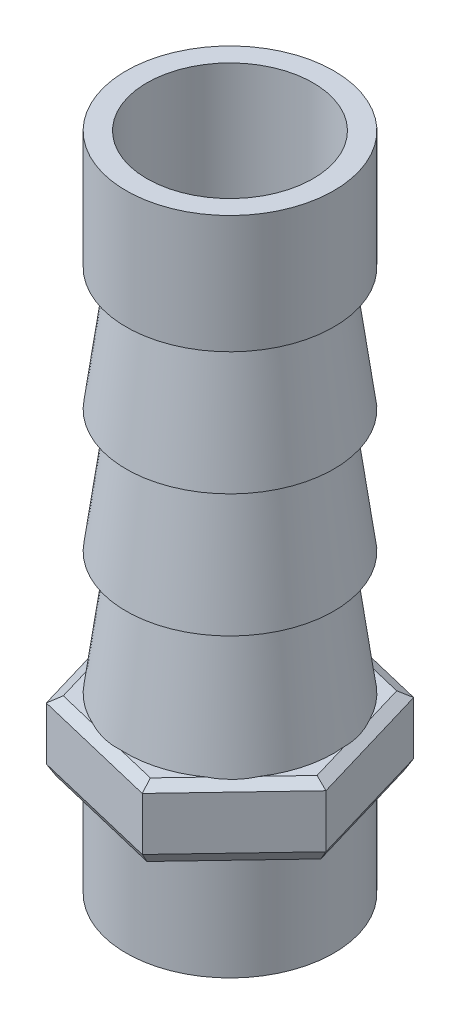
ISO-10303-21;
HEADER;
FILE_DESCRIPTION(('STEP AP214'),'2;1');
FILE_NAME('part.step','',(''),(''),'','','');
FILE_SCHEMA(('AUTOMOTIVE_DESIGN { 1 0 10303 214 1 1 1 1 }'));
ENDSEC;
DATA;
#1=APPLICATION_CONTEXT('core data for automotive mechanical design processes');
#2=APPLICATION_PROTOCOL_DEFINITION('international standard','automotive_design',2000,#1);
#3=PRODUCT_CONTEXT('',#1,'mechanical');
#4=PRODUCT('Part','Part','',(#3));
#5=PRODUCT_RELATED_PRODUCT_CATEGORY('part','',(#4));
#6=PRODUCT_DEFINITION_FORMATION('','',#4);
#7=PRODUCT_DEFINITION_CONTEXT('part definition',#1,'design');
#8=PRODUCT_DEFINITION('design','',#6,#7);
#9=PRODUCT_DEFINITION_SHAPE('','',#8);
#10=(LENGTH_UNIT() NAMED_UNIT(*) SI_UNIT(.MILLI.,.METRE.));
#11=(NAMED_UNIT(*) PLANE_ANGLE_UNIT() SI_UNIT($,.RADIAN.));
#12=(NAMED_UNIT(*) SI_UNIT($,.STERADIAN.) SOLID_ANGLE_UNIT());
#13=UNCERTAINTY_MEASURE_WITH_UNIT(LENGTH_MEASURE(1.E-05),#10,'distance_accuracy_value','');
#14=(GEOMETRIC_REPRESENTATION_CONTEXT(3) GLOBAL_UNCERTAINTY_ASSIGNED_CONTEXT((#13)) GLOBAL_UNIT_ASSIGNED_CONTEXT((#10,
#11,#12)) REPRESENTATION_CONTEXT('',''));
#15=CARTESIAN_POINT('',(0.,0.,0.));
#16=DIRECTION('',(0.,0.,1.));
#17=DIRECTION('',(1.,0.,0.));
#18=AXIS2_PLACEMENT_3D('',#15,#16,#17);
#19=CARTESIAN_POINT('',(0.,-3.18825551680268,0.));
#20=DIRECTION('',(0.,-1.,0.));
#21=DIRECTION('',(0.,0.,-1.));
#22=AXIS2_PLACEMENT_3D('',#19,#20,#21);
#23=PLANE('',#22);
#24=DIRECTION('',(0.283589135690206,0.,0.958945880703641));
#25=VECTOR('',#24,1.);
#26=CARTESIAN_POINT('',(-8.4866710442273,-3.18825551680268,2.50976385085834));
#27=LINE('',#26,#25);
#28=CARTESIAN_POINT('',(-8.022632208215,-3.18825551680268,4.07889353277471));
#29=VERTEX_POINT('',#28);
#30=CARTESIAN_POINT('',(-7.03765820933184,-3.18825551680268,7.40954566276678));
#31=VERTEX_POINT('',#30);
#32=EDGE_CURVE('E57',#29,#31,#27,.T.);
#33=ORIENTED_EDGE('',*,*,#32,.T.);
#34=DIRECTION('',(0.972266061388898,0.,0.23387754460683));
#35=VECTOR('',#34,1.);
#36=CARTESIAN_POINT('',(-2.06981626977046,-3.18825551680268,8.60455464329182));
#37=LINE('',#36,#35);
#38=CARTESIAN_POINT('',(-3.66074185414839,-3.18825551680268,8.22185922266285));
#39=VERTEX_POINT('',#38);
#40=EDGE_CURVE('E245',#31,#39,#37,.T.);
#41=ORIENTED_EDGE('',*,*,#40,.T.);
#42=CARTESIAN_POINT('',(0.,-3.18825551680268,0.));
#43=DIRECTION('',(0.,-1.,0.));
#44=DIRECTION('',(0.,0.,-1.));
#45=AXIS2_PLACEMENT_3D('',#42,#43,#44);
#46=CIRCLE('',#45,9.);
#47=EDGE_CURVE('E323',#39,#29,#46,.T.);
#48=ORIENTED_EDGE('',*,*,#47,.T.);
#49=EDGE_LOOP('',(#33,#41,#48));
#50=FACE_BOUND('',#49,.T.);
#51=ADVANCED_FACE('F40',(#50),#23,.F.);
#52=DIRECTION('',(-0.688676925698692,0.,0.725068336096811));
#53=VECTOR('',#52,1.);
#54=CARTESIAN_POINT('',(-6.41685477445684,-3.18825551680268,-6.09479079243348));
#55=LINE('',#54,#53);
#56=CARTESIAN_POINT('',(-7.54374152282245,-3.18825551680268,-4.90835653114609));
#57=VERTEX_POINT('',#56);
#58=CARTESIAN_POINT('',(-9.93568387912276,-3.18825551680268,-2.39001796105009));
#59=VERTEX_POINT('',#58);
#60=EDGE_CURVE('E65',#57,#59,#55,.T.);
#61=ORIENTED_EDGE('',*,*,#60,.T.);
#62=DIRECTION('',(0.283589135690206,0.,0.958945880703641));
#63=VECTOR('',#62,1.);
#64=CARTESIAN_POINT('',(-8.4866710442273,-3.18825551680268,2.50976385085834));
#65=LINE('',#64,#63);
#66=CARTESIAN_POINT('',(-8.9507098802396,-3.18825551680268,0.940634168941981));
#67=VERTEX_POINT('',#66);
#68=EDGE_CURVE('E242',#59,#67,#65,.T.);
#69=ORIENTED_EDGE('',*,*,#68,.T.);
#70=EDGE_CURVE('E320',#67,#57,#46,.T.);
#71=ORIENTED_EDGE('',*,*,#70,.T.);
#72=EDGE_LOOP('',(#61,#69,#71));
#73=FACE_BOUND('',#72,.T.);
#74=ADVANCED_FACE('F447',(#73),#23,.F.);
#75=DIRECTION('',(-0.972266061388898,0.,-0.23387754460683));
#76=VECTOR('',#75,1.);
#77=CARTESIAN_POINT('',(2.06981626977046,-3.18825551680268,-8.60455464329182));
#78=LINE('',#77,#76);
#79=CARTESIAN_POINT('',(0.47889068539253,-3.18825551680268,-8.98725006392079));
#80=VERTEX_POINT('',#79);
#81=CARTESIAN_POINT('',(-2.89802566979092,-3.18825551680268,-9.79956362381687));
#82=VERTEX_POINT('',#81);
#83=EDGE_CURVE('E237',#80,#82,#78,.T.);
#84=ORIENTED_EDGE('',*,*,#83,.T.);
#85=DIRECTION('',(-0.688676925698692,0.,0.725068336096811));
#86=VECTOR('',#85,1.);
#87=CARTESIAN_POINT('',(-6.41685477445684,-3.18825551680268,-6.09479079243348));
#88=LINE('',#87,#86);
#89=CARTESIAN_POINT('',(-5.28996802609122,-3.18825551680268,-7.28122505372087));
#90=VERTEX_POINT('',#89);
#91=EDGE_CURVE('E239',#82,#90,#88,.T.);
#92=ORIENTED_EDGE('',*,*,#91,.T.);
#93=EDGE_CURVE('E313',#90,#80,#46,.T.);
#94=ORIENTED_EDGE('',*,*,#93,.T.);
#95=EDGE_LOOP('',(#84,#92,#94));
#96=FACE_BOUND('',#95,.T.);
#97=ADVANCED_FACE('F452',(#96),#23,.F.);
#98=DIRECTION('',(-0.283589135690206,0.,-0.958945880703641));
#99=VECTOR('',#98,1.);
#100=CARTESIAN_POINT('',(8.4866710442273,-3.18825551680268,-2.50976385085834));
#101=LINE('',#100,#99);
#102=CARTESIAN_POINT('',(8.02263220821499,-3.18825551680268,-4.07889353277472));
#103=VERTEX_POINT('',#102);
#104=CARTESIAN_POINT('',(7.03765820933184,-3.18825551680268,-7.40954566276678));
#105=VERTEX_POINT('',#104);
#106=EDGE_CURVE('E233',#103,#105,#101,.T.);
#107=ORIENTED_EDGE('',*,*,#106,.T.);
#108=DIRECTION('',(-0.972266061388898,0.,-0.23387754460683));
#109=VECTOR('',#108,1.);
#110=CARTESIAN_POINT('',(2.06981626977046,-3.18825551680268,-8.60455464329182));
#111=LINE('',#110,#109);
#112=CARTESIAN_POINT('',(3.66074185414839,-3.18825551680268,-8.22185922266285));
#113=VERTEX_POINT('',#112);
#114=EDGE_CURVE('E235',#105,#113,#111,.T.);
#115=ORIENTED_EDGE('',*,*,#114,.T.);
#116=EDGE_CURVE('E304',#113,#103,#46,.T.);
#117=ORIENTED_EDGE('',*,*,#116,.T.);
#118=EDGE_LOOP('',(#107,#115,#117));
#119=FACE_BOUND('',#118,.T.);
#120=ADVANCED_FACE('F303',(#119),#23,.F.);
#121=CARTESIAN_POINT('',(5.28996802609122,-3.18825551680268,7.28122505372087));
#122=VERTEX_POINT('',#121);
#123=CARTESIAN_POINT('',(-0.478890685392535,-3.18825551680268,8.98725006392079));
#124=VERTEX_POINT('',#123);
#125=EDGE_CURVE('E318',#122,#124,#46,.T.);
#126=ORIENTED_EDGE('',*,*,#125,.T.);
#127=DIRECTION('',(0.972266061388898,0.,0.23387754460683));
#128=VECTOR('',#127,1.);
#129=CARTESIAN_POINT('',(-2.06981626977046,-3.18825551680268,8.60455464329182));
#130=LINE('',#129,#128);
#131=CARTESIAN_POINT('',(2.89802566979092,-3.18825551680268,9.79956362381687));
#132=VERTEX_POINT('',#131);
#133=EDGE_CURVE('E231',#124,#132,#130,.T.);
#134=ORIENTED_EDGE('',*,*,#133,.T.);
#135=DIRECTION('',(0.688676925698692,0.,-0.725068336096811));
#136=VECTOR('',#135,1.);
#137=CARTESIAN_POINT('',(6.41685477445684,-3.18825551680268,6.09479079243348));
#138=LINE('',#137,#136);
#139=EDGE_CURVE('E229',#132,#122,#138,.T.);
#140=ORIENTED_EDGE('',*,*,#139,.T.);
#141=EDGE_LOOP('',(#126,#134,#140));
#142=FACE_BOUND('',#141,.T.);
#143=ADVANCED_FACE('F364',(#142),#23,.F.);
#144=CARTESIAN_POINT('',(0.,39.0288731666496,0.));
#145=DIRECTION('',(0.,1.,0.));
#146=DIRECTION('',(0.,0.,1.));
#147=AXIS2_PLACEMENT_3D('',#144,#145,#146);
#148=PLANE('',#147);
#149=CARTESIAN_POINT('',(0.,39.0288731666496,0.));
#150=DIRECTION('',(0.,1.,0.));
#151=DIRECTION('',(0.,0.,1.));
#152=AXIS2_PLACEMENT_3D('',#149,#150,#151);
#153=CIRCLE('',#152,7.2);
#154=CARTESIAN_POINT('',(0.,39.0288731666496,7.2));
#155=VERTEX_POINT('',#154);
#156=EDGE_CURVE('E345',#155,#155,#153,.T.);
#157=ORIENTED_EDGE('',*,*,#156,.F.);
#158=EDGE_LOOP('',(#157));
#159=FACE_BOUND('',#158,.T.);
#160=CARTESIAN_POINT('',(0.,39.0288731666496,0.));
#161=DIRECTION('',(0.,-1.,0.));
#162=DIRECTION('',(0.,0.,-1.));
#163=AXIS2_PLACEMENT_3D('',#160,#161,#162);
#164=CIRCLE('',#163,9.);
#165=CARTESIAN_POINT('',(0.,39.0288731666496,-9.));
#166=VERTEX_POINT('',#165);
#167=EDGE_CURVE('E190',#166,#166,#164,.T.);
#168=ORIENTED_EDGE('',*,*,#167,.F.);
#169=EDGE_LOOP('',(#168));
#170=FACE_BOUND('',#169,.T.);
#171=ADVANCED_FACE('F360',(#159,#170),#148,.T.);
#172=CARTESIAN_POINT('',(0.,-3.18825551680268,0.));
#173=DIRECTION('',(0.,-1.,0.));
#174=DIRECTION('',(0.,0.,-1.));
#175=AXIS2_PLACEMENT_3D('',#172,#173,#174);
#176=CYLINDRICAL_SURFACE('',#175,9.);
#177=ORIENTED_EDGE('',*,*,#167,.T.);
#178=EDGE_LOOP('',(#177));
#179=FACE_BOUND('',#178,.T.);
#180=CARTESIAN_POINT('',(0.,28.8018985528721,0.));
#181=DIRECTION('',(0.,-1.,0.));
#182=DIRECTION('',(0.,0.,-1.));
#183=AXIS2_PLACEMENT_3D('',#180,#181,#182);
#184=CIRCLE('',#183,9.);
#185=CARTESIAN_POINT('',(0.,28.8018985528721,-9.));
#186=VERTEX_POINT('',#185);
#187=EDGE_CURVE('E369',#186,#186,#184,.T.);
#188=ORIENTED_EDGE('',*,*,#187,.F.);
#189=EDGE_LOOP('',(#188));
#190=FACE_BOUND('',#189,.T.);
#191=ADVANCED_FACE('F363',(#179,#190),#176,.T.);
#192=CARTESIAN_POINT('',(0.,28.8018985528721,0.));
#193=DIRECTION('',(0.,-1.,0.));
#194=DIRECTION('',(0.,0.,-1.));
#195=AXIS2_PLACEMENT_3D('',#192,#193,#194);
#196=PLANE('',#195);
#197=ORIENTED_EDGE('',*,*,#187,.T.);
#198=EDGE_LOOP('',(#197));
#199=FACE_BOUND('',#198,.T.);
#200=CARTESIAN_POINT('',(0.,28.8018985528721,0.));
#201=DIRECTION('',(0.,-1.,0.));
#202=DIRECTION('',(0.,0.,-1.));
#203=AXIS2_PLACEMENT_3D('',#200,#201,#202);
#204=CIRCLE('',#203,7.57484830734256);
#205=CARTESIAN_POINT('',(0.,28.8018985528721,-7.57484830734256));
#206=VERTEX_POINT('',#205);
#207=EDGE_CURVE('E372',#206,#206,#204,.T.);
#208=ORIENTED_EDGE('',*,*,#207,.F.);
#209=EDGE_LOOP('',(#208));
#210=FACE_BOUND('',#209,.T.);
#211=ADVANCED_FACE('F498',(#199,#210),#196,.T.);
#212=CARTESIAN_POINT('',(0.,18.1385138629805,0.));
#213=DIRECTION('',(0.,-1.,0.));
#214=DIRECTION('',(0.,0.,-1.));
#215=AXIS2_PLACEMENT_3D('',#212,#213,#214);
#216=CONICAL_SURFACE('',#215,9.,0.132861763717756);
#217=ORIENTED_EDGE('',*,*,#207,.T.);
#218=EDGE_LOOP('',(#217));
#219=FACE_BOUND('',#218,.T.);
#220=CARTESIAN_POINT('',(0.,18.1385138629805,0.));
#221=DIRECTION('',(0.,-1.,0.));
#222=DIRECTION('',(0.,0.,-1.));
#223=AXIS2_PLACEMENT_3D('',#220,#221,#222);
#224=CIRCLE('',#223,9.);
#225=CARTESIAN_POINT('',(0.,18.1385138629805,-9.));
#226=VERTEX_POINT('',#225);
#227=EDGE_CURVE('E526',#226,#226,#224,.T.);
#228=ORIENTED_EDGE('',*,*,#227,.F.);
#229=EDGE_LOOP('',(#228));
#230=FACE_BOUND('',#229,.T.);
#231=ADVANCED_FACE('F501',(#219,#230),#216,.T.);
#232=CARTESIAN_POINT('',(0.,18.1385138629805,0.));
#233=DIRECTION('',(0.,-1.,0.));
#234=DIRECTION('',(0.,0.,-1.));
#235=AXIS2_PLACEMENT_3D('',#232,#233,#234);
#236=PLANE('',#235);
#237=ORIENTED_EDGE('',*,*,#227,.T.);
#238=EDGE_LOOP('',(#237));
#239=FACE_BOUND('',#238,.T.);
#240=CARTESIAN_POINT('',(0.,18.1385138629805,0.));
#241=DIRECTION('',(0.,-1.,0.));
#242=DIRECTION('',(0.,0.,-1.));
#243=AXIS2_PLACEMENT_3D('',#240,#241,#242);
#244=CIRCLE('',#243,7.57484830734256);
#245=CARTESIAN_POINT('',(0.,18.1385138629805,-7.57484830734256));
#246=VERTEX_POINT('',#245);
#247=EDGE_CURVE('E523',#246,#246,#244,.T.);
#248=ORIENTED_EDGE('',*,*,#247,.F.);
#249=EDGE_LOOP('',(#248));
#250=FACE_BOUND('',#249,.T.);
#251=ADVANCED_FACE('F505',(#239,#250),#236,.T.);
#252=CARTESIAN_POINT('',(0.,7.47512917308891,0.));
#253=DIRECTION('',(0.,-1.,0.));
#254=DIRECTION('',(0.,0.,-1.));
#255=AXIS2_PLACEMENT_3D('',#252,#253,#254);
#256=CONICAL_SURFACE('',#255,9.,0.132861763717756);
#257=ORIENTED_EDGE('',*,*,#247,.T.);
#258=EDGE_LOOP('',(#257));
#259=FACE_BOUND('',#258,.T.);
#260=CARTESIAN_POINT('',(0.,7.47512917308891,0.));
#261=DIRECTION('',(0.,-1.,0.));
#262=DIRECTION('',(0.,0.,-1.));
#263=AXIS2_PLACEMENT_3D('',#260,#261,#262);
#264=CIRCLE('',#263,9.);
#265=CARTESIAN_POINT('',(0.,7.47512917308891,-9.));
#266=VERTEX_POINT('',#265);
#267=EDGE_CURVE('E315',#266,#266,#264,.T.);
#268=ORIENTED_EDGE('',*,*,#267,.F.);
#269=EDGE_LOOP('',(#268));
#270=FACE_BOUND('',#269,.T.);
#271=ADVANCED_FACE('F509',(#259,#270),#256,.T.);
#272=CARTESIAN_POINT('',(0.,7.47512917308891,0.));
#273=DIRECTION('',(0.,-1.,0.));
#274=DIRECTION('',(0.,0.,-1.));
#275=AXIS2_PLACEMENT_3D('',#272,#273,#274);
#276=PLANE('',#275);
#277=ORIENTED_EDGE('',*,*,#267,.T.);
#278=EDGE_LOOP('',(#277));
#279=FACE_BOUND('',#278,.T.);
#280=CARTESIAN_POINT('',(0.,7.47512917308891,0.));
#281=DIRECTION('',(0.,-1.,0.));
#282=DIRECTION('',(0.,0.,-1.));
#283=AXIS2_PLACEMENT_3D('',#280,#281,#282);
#284=CIRCLE('',#283,7.57484830734256);
#285=CARTESIAN_POINT('',(0.,7.47512917308891,-7.57484830734256));
#286=VERTEX_POINT('',#285);
#287=EDGE_CURVE('E310',#286,#286,#284,.T.);
#288=ORIENTED_EDGE('',*,*,#287,.F.);
#289=EDGE_LOOP('',(#288));
#290=FACE_BOUND('',#289,.T.);
#291=ADVANCED_FACE('F443',(#279,#290),#276,.T.);
#292=CARTESIAN_POINT('',(0.,-3.18825551680268,0.));
#293=DIRECTION('',(0.,-1.,0.));
#294=DIRECTION('',(0.,0.,-1.));
#295=AXIS2_PLACEMENT_3D('',#292,#293,#294);
#296=CONICAL_SURFACE('',#295,9.,0.132861763717756);
#297=ORIENTED_EDGE('',*,*,#287,.T.);
#298=EDGE_LOOP('',(#297));
#299=FACE_BOUND('',#298,.T.);
#300=ORIENTED_EDGE('',*,*,#116,.F.);
#301=CARTESIAN_POINT('',(0.150994128980184,1.54855015376594,-0.62770655183338));
#302=DIRECTION('',(-0.116938772303416,-0.866025403784436,0.486133030694454));
#303=DIRECTION('',(0.202543895004242,-0.500000000000005,-0.842007108400223));
#304=AXIS2_PLACEMENT_3D('',#301,#302,#303);
#305=ELLIPSE('',#304,9.66129882750243,8.34198456804635);
#306=EDGE_CURVE('E253',#113,#80,#305,.F.);
#307=ORIENTED_EDGE('',*,*,#306,.T.);
#308=ORIENTED_EDGE('',*,*,#93,.F.);
#309=CARTESIAN_POINT('',(-0.468112755519548,1.54855015376595,-0.444618027435834));
#310=DIRECTION('',(0.36253416804841,-0.866025403784435,0.34433846284935));
#311=DIRECTION('',(-0.627927598539549,-0.500000000000006,-0.596411712655233));
#312=AXIS2_PLACEMENT_3D('',#309,#310,#311);
#313=ELLIPSE('',#312,9.66129882750243,8.34198456804635);
#314=EDGE_CURVE('E251',#90,#57,#313,.F.);
#315=ORIENTED_EDGE('',*,*,#314,.T.);
#316=ORIENTED_EDGE('',*,*,#70,.F.);
#317=CARTESIAN_POINT('',(-0.619106884499733,1.54855015376595,0.183088524397546));
#318=DIRECTION('',(0.479472940351826,-0.866025403784435,-0.141794567845105));
#319=DIRECTION('',(-0.830471493543792,-0.500000000000006,0.24559539574499));
#320=AXIS2_PLACEMENT_3D('',#317,#318,#319);
#321=ELLIPSE('',#320,9.66129882750243,8.34198456804634);
#322=EDGE_CURVE('E249',#67,#29,#321,.F.);
#323=ORIENTED_EDGE('',*,*,#322,.T.);
#324=ORIENTED_EDGE('',*,*,#47,.F.);
#325=CARTESIAN_POINT('',(-0.150994128980183,1.54855015376593,0.627706551833379));
#326=DIRECTION('',(0.116938772303416,-0.866025403784436,-0.486133030694454));
#327=DIRECTION('',(-0.202543895004242,-0.500000000000005,0.842007108400224));
#328=AXIS2_PLACEMENT_3D('',#325,#326,#327);
#329=ELLIPSE('',#328,9.66129882750243,8.34198456804635);
#330=EDGE_CURVE('E247',#39,#124,#329,.F.);
#331=ORIENTED_EDGE('',*,*,#330,.T.);
#332=ORIENTED_EDGE('',*,*,#125,.F.);
#333=CARTESIAN_POINT('',(0.46811275551955,1.54855015376595,0.444618027435834));
#334=DIRECTION('',(-0.36253416804841,-0.866025403784435,-0.34433846284935));
#335=DIRECTION('',(0.627927598539549,-0.500000000000006,0.596411712655233));
#336=AXIS2_PLACEMENT_3D('',#333,#334,#335);
#337=ELLIPSE('',#336,9.66129882750243,8.34198456804634);
#338=CARTESIAN_POINT('',(7.54374152282245,-3.18825551680268,4.90835653114608));
#339=VERTEX_POINT('',#338);
#340=EDGE_CURVE('E49',#122,#339,#337,.F.);
#341=ORIENTED_EDGE('',*,*,#340,.T.);
#342=CARTESIAN_POINT('',(8.9507098802396,-3.18825551680268,-0.940634168941968));
#343=VERTEX_POINT('',#342);
#344=EDGE_CURVE('E311',#343,#339,#46,.T.);
#345=ORIENTED_EDGE('',*,*,#344,.F.);
#346=CARTESIAN_POINT('',(0.619106884499734,1.54855015376594,-0.183088524397547));
#347=DIRECTION('',(-0.479472940351826,-0.866025403784435,0.141794567845104));
#348=DIRECTION('',(0.830471493543792,-0.500000000000005,-0.24559539574499));
#349=AXIS2_PLACEMENT_3D('',#346,#347,#348);
#350=ELLIPSE('',#349,9.66129882750243,8.34198456804634);
#351=EDGE_CURVE('E255',#343,#103,#350,.F.);
#352=ORIENTED_EDGE('',*,*,#351,.T.);
#353=EDGE_LOOP('',(#300,#307,#308,#315,#316,#323,#324,#331,#332,#341,#345,#352));
#354=FACE_BOUND('',#353,.T.);
#355=ADVANCED_FACE('F306',(#299,#354),#296,.T.);
#356=CARTESIAN_POINT('',(-3.19274014468491,-9.18825551680268,-10.7961294160694));
#357=DIRECTION('',(-0.23387754460683,0.,0.972266061388898));
#358=DIRECTION('',(0.972266061388898,0.,0.23387754460683));
#359=AXIS2_PLACEMENT_3D('',#356,#357,#358);
#360=PLANE('',#359);
#361=DIRECTION('',(0.,1.,0.));
#362=VECTOR('',#361,1.);
#363=CARTESIAN_POINT('',(7.75335226451813,-9.18825551680268,-8.16305878101425));
#364=LINE('',#363,#362);
#365=CARTESIAN_POINT('',(7.75335226451813,-8.28825551680266,-8.16305878101425));
#366=VERTEX_POINT('',#365);
#367=CARTESIAN_POINT('',(7.75335226451813,-3.70787075907335,-8.16305878101425));
#368=VERTEX_POINT('',#367);
#369=EDGE_CURVE('E321',#366,#368,#364,.T.);
#370=ORIENTED_EDGE('',*,*,#369,.F.);
#371=DIRECTION('',(-0.972266061388898,0.,-0.23387754460683));
#372=VECTOR('',#371,1.);
#373=CARTESIAN_POINT('',(-3.19274014468491,-8.28825551680266,-10.7961294160694));
#374=LINE('',#373,#372);
#375=CARTESIAN_POINT('',(-3.19274014468491,-8.28825551680266,-10.7961294160694));
#376=VERTEX_POINT('',#375);
#377=EDGE_CURVE('E223',#366,#376,#374,.T.);
#378=ORIENTED_EDGE('',*,*,#377,.T.);
#379=DIRECTION('',(0.,1.,0.));
#380=VECTOR('',#379,1.);
#381=CARTESIAN_POINT('',(-3.19274014468491,-9.18825551680268,-10.7961294160694));
#382=LINE('',#381,#380);
#383=CARTESIAN_POINT('',(-3.19274014468491,-3.70787075907335,-10.7961294160694));
#384=VERTEX_POINT('',#383);
#385=EDGE_CURVE('E269',#376,#384,#382,.T.);
#386=ORIENTED_EDGE('',*,*,#385,.T.);
#387=DIRECTION('',(0.972266061388898,0.,0.23387754460683));
#388=VECTOR('',#387,1.);
#389=CARTESIAN_POINT('',(-3.19274014468491,-3.70787075907335,-10.7961294160694));
#390=LINE('',#389,#388);
#391=EDGE_CURVE('E221',#384,#368,#390,.T.);
#392=ORIENTED_EDGE('',*,*,#391,.T.);
#393=EDGE_LOOP('',(#370,#378,#386,#392));
#394=FACE_BOUND('',#393,.T.);
#395=ADVANCED_FACE('F435',(#394),#360,.F.);
#396=CARTESIAN_POINT('',(7.75335226451813,-9.18825551680268,-8.16305878101425));
#397=DIRECTION('',(-0.958945880703641,0.,0.283589135690206));
#398=DIRECTION('',(0.283589135690206,0.,0.958945880703641));
#399=AXIS2_PLACEMENT_3D('',#396,#397,#398);
#400=PLANE('',#399);
#401=DIRECTION('',(0.,1.,0.));
#402=VECTOR('',#401,1.);
#403=CARTESIAN_POINT('',(10.946092409203,-9.18825551680268,2.63307063505518));
#404=LINE('',#403,#402);
#405=CARTESIAN_POINT('',(10.946092409203,-8.28825551680266,2.63307063505518));
#406=VERTEX_POINT('',#405);
#407=CARTESIAN_POINT('',(10.946092409203,-3.70787075907335,2.63307063505518));
#408=VERTEX_POINT('',#407);
#409=EDGE_CURVE('E325',#406,#408,#404,.T.);
#410=ORIENTED_EDGE('',*,*,#409,.F.);
#411=DIRECTION('',(-0.283589135690206,0.,-0.958945880703641));
#412=VECTOR('',#411,1.);
#413=CARTESIAN_POINT('',(7.75335226451813,-8.28825551680266,-8.16305878101425));
#414=LINE('',#413,#412);
#415=EDGE_CURVE('E219',#406,#366,#414,.T.);
#416=ORIENTED_EDGE('',*,*,#415,.T.);
#417=ORIENTED_EDGE('',*,*,#369,.T.);
#418=DIRECTION('',(0.283589135690206,0.,0.958945880703641));
#419=VECTOR('',#418,1.);
#420=CARTESIAN_POINT('',(7.75335226451813,-3.70787075907335,-8.16305878101425));
#421=LINE('',#420,#419);
#422=EDGE_CURVE('E217',#368,#408,#421,.T.);
#423=ORIENTED_EDGE('',*,*,#422,.T.);
#424=EDGE_LOOP('',(#410,#416,#417,#423));
#425=FACE_BOUND('',#424,.T.);
#426=ADVANCED_FACE('F428',(#425),#400,.F.);
#427=CARTESIAN_POINT('',(10.946092409203,-9.18825551680268,2.63307063505518));
#428=DIRECTION('',(-0.725068336096811,0.,-0.688676925698692));
#429=DIRECTION('',(-0.688676925698692,0.,0.725068336096811));
#430=AXIS2_PLACEMENT_3D('',#427,#428,#429);
#431=PLANE('',#430);
#432=DIRECTION('',(0.,1.,0.));
#433=VECTOR('',#432,1.);
#434=CARTESIAN_POINT('',(3.19274014468491,-9.18825551680268,10.7961294160694));
#435=LINE('',#434,#433);
#436=CARTESIAN_POINT('',(3.19274014468491,-8.28825551680266,10.7961294160694));
#437=VERTEX_POINT('',#436);
#438=CARTESIAN_POINT('',(3.19274014468491,-3.70787075907335,10.7961294160694));
#439=VERTEX_POINT('',#438);
#440=EDGE_CURVE('E329',#437,#439,#435,.T.);
#441=ORIENTED_EDGE('',*,*,#440,.F.);
#442=DIRECTION('',(0.688676925698692,0.,-0.725068336096811));
#443=VECTOR('',#442,1.);
#444=CARTESIAN_POINT('',(10.946092409203,-8.28825551680266,2.63307063505518));
#445=LINE('',#444,#443);
#446=EDGE_CURVE('E215',#437,#406,#445,.T.);
#447=ORIENTED_EDGE('',*,*,#446,.T.);
#448=ORIENTED_EDGE('',*,*,#409,.T.);
#449=DIRECTION('',(-0.688676925698692,0.,0.725068336096811));
#450=VECTOR('',#449,1.);
#451=CARTESIAN_POINT('',(10.946092409203,-3.70787075907335,2.63307063505518));
#452=LINE('',#451,#450);
#453=EDGE_CURVE('E213',#408,#439,#452,.T.);
#454=ORIENTED_EDGE('',*,*,#453,.T.);
#455=EDGE_LOOP('',(#441,#447,#448,#454));
#456=FACE_BOUND('',#455,.T.);
#457=ADVANCED_FACE('F424',(#456),#431,.F.);
#458=CARTESIAN_POINT('',(3.19274014468491,-9.18825551680268,10.7961294160694));
#459=DIRECTION('',(0.23387754460683,0.,-0.972266061388898));
#460=DIRECTION('',(-0.972266061388898,0.,-0.23387754460683));
#461=AXIS2_PLACEMENT_3D('',#458,#459,#460);
#462=PLANE('',#461);
#463=DIRECTION('',(0.,1.,0.));
#464=VECTOR('',#463,1.);
#465=CARTESIAN_POINT('',(-7.75335226451813,-9.18825551680268,8.16305878101424));
#466=LINE('',#465,#464);
#467=CARTESIAN_POINT('',(-7.75335226451813,-8.28825551680266,8.16305878101424));
#468=VERTEX_POINT('',#467);
#469=CARTESIAN_POINT('',(-7.75335226451813,-3.70787075907335,8.16305878101424));
#470=VERTEX_POINT('',#469);
#471=EDGE_CURVE('E334',#468,#470,#466,.T.);
#472=ORIENTED_EDGE('',*,*,#471,.F.);
#473=DIRECTION('',(0.972266061388898,0.,0.23387754460683));
#474=VECTOR('',#473,1.);
#475=CARTESIAN_POINT('',(3.19274014468491,-8.28825551680266,10.7961294160694));
#476=LINE('',#475,#474);
#477=EDGE_CURVE('E211',#468,#437,#476,.T.);
#478=ORIENTED_EDGE('',*,*,#477,.T.);
#479=ORIENTED_EDGE('',*,*,#440,.T.);
#480=DIRECTION('',(-0.972266061388898,0.,-0.23387754460683));
#481=VECTOR('',#480,1.);
#482=CARTESIAN_POINT('',(3.19274014468491,-3.70787075907335,10.7961294160694));
#483=LINE('',#482,#481);
#484=EDGE_CURVE('E208',#439,#470,#483,.T.);
#485=ORIENTED_EDGE('',*,*,#484,.T.);
#486=EDGE_LOOP('',(#472,#478,#479,#485));
#487=FACE_BOUND('',#486,.T.);
#488=ADVANCED_FACE('F402',(#487),#462,.F.);
#489=CARTESIAN_POINT('',(-7.75335226451813,-9.18825551680268,8.16305878101424));
#490=DIRECTION('',(0.958945880703641,0.,-0.283589135690206));
#491=DIRECTION('',(-0.283589135690206,0.,-0.958945880703641));
#492=AXIS2_PLACEMENT_3D('',#489,#490,#491);
#493=PLANE('',#492);
#494=DIRECTION('',(0.,1.,0.));
#495=VECTOR('',#494,1.);
#496=CARTESIAN_POINT('',(-10.946092409203,-9.18825551680268,-2.63307063505518));
#497=LINE('',#496,#495);
#498=CARTESIAN_POINT('',(-10.946092409203,-8.28825551680266,-2.63307063505518));
#499=VERTEX_POINT('',#498);
#500=CARTESIAN_POINT('',(-10.946092409203,-3.70787075907335,-2.63307063505518));
#501=VERTEX_POINT('',#500);
#502=EDGE_CURVE('E337',#499,#501,#497,.T.);
#503=ORIENTED_EDGE('',*,*,#502,.F.);
#504=DIRECTION('',(0.283589135690206,0.,0.958945880703641));
#505=VECTOR('',#504,1.);
#506=CARTESIAN_POINT('',(-7.75335226451813,-8.28825551680266,8.16305878101424));
#507=LINE('',#506,#505);
#508=EDGE_CURVE('E206',#499,#468,#507,.T.);
#509=ORIENTED_EDGE('',*,*,#508,.T.);
#510=ORIENTED_EDGE('',*,*,#471,.T.);
#511=DIRECTION('',(-0.283589135690206,0.,-0.958945880703641));
#512=VECTOR('',#511,1.);
#513=CARTESIAN_POINT('',(-7.75335226451813,-3.70787075907335,8.16305878101424));
#514=LINE('',#513,#512);
#515=EDGE_CURVE('E204',#470,#501,#514,.T.);
#516=ORIENTED_EDGE('',*,*,#515,.T.);
#517=EDGE_LOOP('',(#503,#509,#510,#516));
#518=FACE_BOUND('',#517,.T.);
#519=ADVANCED_FACE('F394',(#518),#493,.F.);
#520=CARTESIAN_POINT('',(-10.946092409203,-9.18825551680268,-2.63307063505518));
#521=DIRECTION('',(0.725068336096811,0.,0.688676925698692));
#522=DIRECTION('',(0.688676925698692,0.,-0.725068336096811));
#523=AXIS2_PLACEMENT_3D('',#520,#521,#522);
#524=PLANE('',#523);
#525=ORIENTED_EDGE('',*,*,#385,.F.);
#526=DIRECTION('',(-0.688676925698692,0.,0.725068336096811));
#527=VECTOR('',#526,1.);
#528=CARTESIAN_POINT('',(-10.946092409203,-8.28825551680266,-2.63307063505518));
#529=LINE('',#528,#527);
#530=EDGE_CURVE('E177',#376,#499,#529,.T.);
#531=ORIENTED_EDGE('',*,*,#530,.T.);
#532=ORIENTED_EDGE('',*,*,#502,.T.);
#533=DIRECTION('',(0.688676925698692,0.,-0.725068336096811));
#534=VECTOR('',#533,1.);
#535=CARTESIAN_POINT('',(-10.946092409203,-3.70787075907335,-2.63307063505518));
#536=LINE('',#535,#534);
#537=EDGE_CURVE('E196',#501,#384,#536,.T.);
#538=ORIENTED_EDGE('',*,*,#537,.T.);
#539=EDGE_LOOP('',(#525,#531,#532,#538));
#540=FACE_BOUND('',#539,.T.);
#541=ADVANCED_FACE('F393',(#540),#524,.F.);
#542=CARTESIAN_POINT('',(0.,-9.18825551680268,0.));
#543=DIRECTION('',(0.,-1.,0.));
#544=DIRECTION('',(0.,0.,-1.));
#545=AXIS2_PLACEMENT_3D('',#542,#543,#544);
#546=PLANE('',#545);
#547=CARTESIAN_POINT('',(0.,-9.18825551680268,0.));
#548=DIRECTION('',(0.,-1.,0.));
#549=DIRECTION('',(0.,0.,-1.));
#550=AXIS2_PLACEMENT_3D('',#547,#548,#549);
#551=CIRCLE('',#550,9.);
#552=CARTESIAN_POINT('',(0.,-9.18825551680268,-9.));
#553=VERTEX_POINT('',#552);
#554=EDGE_CURVE('E11',#553,#553,#551,.T.);
#555=ORIENTED_EDGE('',*,*,#554,.F.);
#556=EDGE_LOOP('',(#555));
#557=FACE_BOUND('',#556,.T.);
#558=DIRECTION('',(-0.283589135690206,0.,-0.958945880703641));
#559=VECTOR('',#558,1.);
#560=CARTESIAN_POINT('',(-10.4478095130768,-9.18825551680268,-2.78042787250218));
#561=LINE('',#560,#559);
#562=CARTESIAN_POINT('',(-7.34014610909891,-9.18825551680268,7.72801777935615));
#563=VERTEX_POINT('',#562);
#564=CARTESIAN_POINT('',(-10.3627327723697,-9.18825551680268,-2.49274410829109));
#565=VERTEX_POINT('',#564);
#566=EDGE_CURVE('E194',#563,#565,#561,.T.);
#567=ORIENTED_EDGE('',*,*,#566,.T.);
#568=DIRECTION('',(0.688676925698692,0.,-0.725068336096811));
#569=VECTOR('',#568,1.);
#570=CARTESIAN_POINT('',(-2.81598358556117,-9.18825551680268,-10.4382823884763));
#571=LINE('',#570,#569);
#572=CARTESIAN_POINT('',(-3.02258666327078,-9.18825551680268,-10.2207618876472));
#573=VERTEX_POINT('',#572);
#574=EDGE_CURVE('E175',#565,#573,#571,.T.);
#575=ORIENTED_EDGE('',*,*,#574,.T.);
#576=DIRECTION('',(0.972266061388898,0.,0.23387754460683));
#577=VECTOR('',#576,1.);
#578=CARTESIAN_POINT('',(7.63182592751558,-9.18825551680268,-7.65785451597411));
#579=LINE('',#578,#577);
#580=CARTESIAN_POINT('',(7.3401461090989,-9.18825551680268,-7.72801777935616));
#581=VERTEX_POINT('',#580);
#582=EDGE_CURVE('E183',#573,#581,#579,.T.);
#583=ORIENTED_EDGE('',*,*,#582,.T.);
#584=DIRECTION('',(0.283589135690206,0.,0.958945880703641));
#585=VECTOR('',#584,1.);
#586=CARTESIAN_POINT('',(10.4478095130767,-9.18825551680268,2.78042787250218));
#587=LINE('',#586,#585);
#588=CARTESIAN_POINT('',(10.3627327723697,-9.18825551680268,2.49274410829108));
#589=VERTEX_POINT('',#588);
#590=EDGE_CURVE('E189',#581,#589,#587,.T.);
#591=ORIENTED_EDGE('',*,*,#590,.T.);
#592=DIRECTION('',(-0.688676925698692,0.,0.725068336096811));
#593=VECTOR('',#592,1.);
#594=CARTESIAN_POINT('',(2.81598358556117,-9.18825551680268,10.4382823884763));
#595=LINE('',#594,#593);
#596=CARTESIAN_POINT('',(3.02258666327078,-9.18825551680268,10.2207618876472));
#597=VERTEX_POINT('',#596);
#598=EDGE_CURVE('E377',#589,#597,#595,.T.);
#599=ORIENTED_EDGE('',*,*,#598,.T.);
#600=DIRECTION('',(-0.972266061388898,0.,-0.23387754460683));
#601=VECTOR('',#600,1.);
#602=CARTESIAN_POINT('',(-7.63182592751558,-9.18825551680268,7.6578545159741));
#603=LINE('',#602,#601);
#604=EDGE_CURVE('E199',#597,#563,#603,.T.);
#605=ORIENTED_EDGE('',*,*,#604,.T.);
#606=EDGE_LOOP('',(#567,#575,#583,#591,#599,#605));
#607=FACE_BOUND('',#606,.T.);
#608=ADVANCED_FACE('F192',(#557,#607),#546,.T.);
#609=DIRECTION('',(0.688676925698692,0.,-0.725068336096811));
#610=VECTOR('',#609,1.);
#611=CARTESIAN_POINT('',(6.41685477445684,-3.18825551680268,6.09479079243348));
#612=LINE('',#611,#610);
#613=CARTESIAN_POINT('',(9.93568387912275,-3.18825551680268,2.39001796105009));
#614=VERTEX_POINT('',#613);
#615=EDGE_CURVE('E225',#339,#614,#612,.T.);
#616=ORIENTED_EDGE('',*,*,#615,.T.);
#617=DIRECTION('',(-0.283589135690206,0.,-0.958945880703641));
#618=VECTOR('',#617,1.);
#619=CARTESIAN_POINT('',(8.4866710442273,-3.18825551680268,-2.50976385085834));
#620=LINE('',#619,#618);
#621=EDGE_CURVE('E227',#614,#343,#620,.T.);
#622=ORIENTED_EDGE('',*,*,#621,.T.);
#623=ORIENTED_EDGE('',*,*,#344,.T.);
#624=EDGE_LOOP('',(#616,#622,#623));
#625=FACE_BOUND('',#624,.T.);
#626=ADVANCED_FACE('F422',(#625),#23,.F.);
#627=CARTESIAN_POINT('',(6.69265971782023,-9.18825551680268,6.35675299796916));
#628=DIRECTION('',(0.627927598539553,-0.499999999999998,0.596411712655236));
#629=DIRECTION('',(0.688676925698692,0.,-0.725068336096811));
#630=AXIS2_PLACEMENT_3D('',#627,#628,#629);
#631=PLANE('',#630);
#632=DIRECTION('',(-0.53931617503555,-0.832050294337845,-0.129731919886083));
#633=VECTOR('',#632,1.);
#634=CARTESIAN_POINT('',(9.56559948218741,-10.4180628532486,2.30099456149946));
#635=LINE('',#634,#633);
#636=EDGE_CURVE('E263',#406,#589,#635,.T.);
#637=ORIENTED_EDGE('',*,*,#636,.F.);
#638=ORIENTED_EDGE('',*,*,#446,.F.);
#639=DIRECTION('',(-0.157306949214698,-0.832050294337844,-0.531927468195685));
#640=VECTOR('',#639,1.);
#641=CARTESIAN_POINT('',(2.79007999686534,-10.4180628532486,9.43454943475129));
#642=LINE('',#641,#640);
#643=EDGE_CURVE('E266',#597,#437,#642,.F.);
#644=ORIENTED_EDGE('',*,*,#643,.F.);
#645=ORIENTED_EDGE('',*,*,#598,.F.);
#646=EDGE_LOOP('',(#637,#638,#644,#645));
#647=FACE_BOUND('',#646,.T.);
#648=ADVANCED_FACE('F431',(#647),#631,.T.);
#649=CARTESIAN_POINT('',(-2.15877972291406,-9.18825551680268,8.97438983350169));
#650=DIRECTION('',(-0.202543895004243,-0.5,0.842007108400226));
#651=DIRECTION('',(0.972266061388898,0.,0.23387754460683));
#652=AXIS2_PLACEMENT_3D('',#649,#650,#651);
#653=PLANE('',#652);
#654=ORIENTED_EDGE('',*,*,#643,.T.);
#655=ORIENTED_EDGE('',*,*,#477,.F.);
#656=DIRECTION('',(0.382009225820849,-0.832050294337844,-0.402195548309603));
#657=VECTOR('',#656,1.);
#658=CARTESIAN_POINT('',(-6.77551948532208,-10.4180628532486,7.13355487325184));
#659=LINE('',#658,#657);
#660=EDGE_CURVE('E260',#563,#468,#659,.F.);
#661=ORIENTED_EDGE('',*,*,#660,.F.);
#662=ORIENTED_EDGE('',*,*,#604,.F.);
#663=EDGE_LOOP('',(#654,#655,#661,#662));
#664=FACE_BOUND('',#663,.T.);
#665=ADVANCED_FACE('F384',(#664),#653,.T.);
#666=CARTESIAN_POINT('',(8.8514394407343,-9.18825551680268,-2.61763683553253));
#667=DIRECTION('',(0.830471493543796,-0.499999999999998,-0.245595395744991));
#668=DIRECTION('',(-0.283589135690206,0.,-0.958945880703641));
#669=AXIS2_PLACEMENT_3D('',#666,#667,#668);
#670=PLANE('',#669);
#671=ORIENTED_EDGE('',*,*,#636,.T.);
#672=ORIENTED_EDGE('',*,*,#590,.F.);
#673=DIRECTION('',(-0.38200922582085,-0.832050294337845,0.4021955483096));
#674=VECTOR('',#673,1.);
#675=CARTESIAN_POINT('',(6.77551948532207,-10.4180628532486,-7.13355487325184));
#676=LINE('',#675,#674);
#677=EDGE_CURVE('E186',#366,#581,#676,.T.);
#678=ORIENTED_EDGE('',*,*,#677,.F.);
#679=ORIENTED_EDGE('',*,*,#415,.F.);
#680=EDGE_LOOP('',(#671,#672,#678,#679));
#681=FACE_BOUND('',#680,.T.);
#682=ADVANCED_FACE('F433',(#681),#670,.T.);
#683=CARTESIAN_POINT('',(-8.8514394407343,-9.18825551680268,2.61763683553253));
#684=DIRECTION('',(-0.830471493543796,-0.499999999999998,0.245595395744991));
#685=DIRECTION('',(0.283589135690206,0.,0.958945880703641));
#686=AXIS2_PLACEMENT_3D('',#683,#684,#685);
#687=PLANE('',#686);
#688=ORIENTED_EDGE('',*,*,#660,.T.);
#689=ORIENTED_EDGE('',*,*,#508,.F.);
#690=DIRECTION('',(0.53931617503555,-0.832050294337845,0.129731919886084));
#691=VECTOR('',#690,1.);
#692=CARTESIAN_POINT('',(-9.56559948218741,-10.4180628532486,-2.30099456149946));
#693=LINE('',#692,#691);
#694=EDGE_CURVE('E180',#565,#499,#693,.F.);
#695=ORIENTED_EDGE('',*,*,#694,.F.);
#696=ORIENTED_EDGE('',*,*,#566,.F.);
#697=EDGE_LOOP('',(#688,#689,#695,#696));
#698=FACE_BOUND('',#697,.T.);
#699=ADVANCED_FACE('F387',(#698),#687,.T.);
#700=CARTESIAN_POINT('',(2.15877972291406,-9.18825551680268,-8.9743898335017));
#701=DIRECTION('',(0.202543895004243,-0.499999999999998,-0.842007108400228));
#702=DIRECTION('',(-0.972266061388898,0.,-0.23387754460683));
#703=AXIS2_PLACEMENT_3D('',#700,#701,#702);
#704=PLANE('',#703);
#705=ORIENTED_EDGE('',*,*,#677,.T.);
#706=ORIENTED_EDGE('',*,*,#582,.F.);
#707=DIRECTION('',(-0.157306949214701,0.832050294337845,-0.531927468195682));
#708=VECTOR('',#707,1.);
#709=CARTESIAN_POINT('',(-2.79007999686533,-10.4180628532486,-9.4345494347513));
#710=LINE('',#709,#708);
#711=EDGE_CURVE('E171',#376,#573,#710,.F.);
#712=ORIENTED_EDGE('',*,*,#711,.F.);
#713=ORIENTED_EDGE('',*,*,#377,.F.);
#714=EDGE_LOOP('',(#705,#706,#712,#713));
#715=FACE_BOUND('',#714,.T.);
#716=ADVANCED_FACE('F184',(#715),#704,.T.);
#717=CARTESIAN_POINT('',(-6.69265971782023,-9.18825551680268,-6.35675299796916));
#718=DIRECTION('',(-0.627927598539552,-0.499999999999999,-0.596411712655236));
#719=DIRECTION('',(-0.688676925698692,0.,0.725068336096811));
#720=AXIS2_PLACEMENT_3D('',#717,#718,#719);
#721=PLANE('',#720);
#722=ORIENTED_EDGE('',*,*,#694,.T.);
#723=ORIENTED_EDGE('',*,*,#530,.F.);
#724=ORIENTED_EDGE('',*,*,#711,.T.);
#725=ORIENTED_EDGE('',*,*,#574,.F.);
#726=EDGE_LOOP('',(#722,#723,#724,#725));
#727=FACE_BOUND('',#726,.T.);
#728=ADVANCED_FACE('F173',(#727),#721,.T.);
#729=CARTESIAN_POINT('',(-3.19274014468491,-3.70787075907335,-10.7961294160694));
#730=DIRECTION('',(-0.116938772303416,-0.866025403784436,0.486133030694454));
#731=DIRECTION('',(0.972266061388898,0.,0.23387754460683));
#732=AXIS2_PLACEMENT_3D('',#729,#730,#731);
#733=PLANE('',#732);
#734=ORIENTED_EDGE('',*,*,#306,.F.);
#735=ORIENTED_EDGE('',*,*,#114,.F.);
#736=DIRECTION('',(-0.615971368159136,0.447213595499963,0.648520835138053));
#737=VECTOR('',#736,1.);
#738=CARTESIAN_POINT('',(7.75335226451813,-3.70787075907335,-8.16305878101425));
#739=LINE('',#738,#737);
#740=EDGE_CURVE('E44',#368,#105,#739,.T.);
#741=ORIENTED_EDGE('',*,*,#740,.F.);
#742=ORIENTED_EDGE('',*,*,#391,.F.);
#743=DIRECTION('',(0.253649834033483,0.447213595499963,0.857707270398696));
#744=VECTOR('',#743,1.);
#745=CARTESIAN_POINT('',(-3.19274014468491,-3.70787075907335,-10.7961294160694));
#746=LINE('',#745,#744);
#747=EDGE_CURVE('E281',#82,#384,#746,.F.);
#748=ORIENTED_EDGE('',*,*,#747,.F.);
#749=ORIENTED_EDGE('',*,*,#83,.F.);
#750=EDGE_LOOP('',(#734,#735,#741,#742,#748,#749));
#751=FACE_BOUND('',#750,.T.);
#752=ADVANCED_FACE('F42',(#751),#733,.F.);
#753=CARTESIAN_POINT('',(7.75335226451813,-3.70787075907335,-8.16305878101425));
#754=DIRECTION('',(-0.479472940351826,-0.866025403784435,0.141794567845104));
#755=DIRECTION('',(0.283589135690206,0.,0.958945880703641));
#756=AXIS2_PLACEMENT_3D('',#753,#754,#755);
#757=PLANE('',#756);
#758=ORIENTED_EDGE('',*,*,#351,.F.);
#759=ORIENTED_EDGE('',*,*,#621,.F.);
#760=DIRECTION('',(-0.869621202192621,0.447213595499963,-0.209186435260643));
#761=VECTOR('',#760,1.);
#762=CARTESIAN_POINT('',(10.946092409203,-3.70787075907335,2.63307063505518));
#763=LINE('',#762,#761);
#764=EDGE_CURVE('E279',#408,#614,#763,.T.);
#765=ORIENTED_EDGE('',*,*,#764,.F.);
#766=ORIENTED_EDGE('',*,*,#422,.F.);
#767=ORIENTED_EDGE('',*,*,#740,.T.);
#768=ORIENTED_EDGE('',*,*,#106,.F.);
#769=EDGE_LOOP('',(#758,#759,#765,#766,#767,#768));
#770=FACE_BOUND('',#769,.T.);
#771=ADVANCED_FACE('F293',(#770),#757,.F.);
#772=CARTESIAN_POINT('',(-10.946092409203,-3.70787075907335,-2.63307063505518));
#773=DIRECTION('',(0.36253416804841,-0.866025403784435,0.34433846284935));
#774=DIRECTION('',(0.688676925698692,0.,-0.725068336096811));
#775=AXIS2_PLACEMENT_3D('',#772,#773,#774);
#776=PLANE('',#775);
#777=ORIENTED_EDGE('',*,*,#747,.T.);
#778=ORIENTED_EDGE('',*,*,#537,.F.);
#779=DIRECTION('',(0.869621202192621,0.447213595499964,0.209186435260645));
#780=VECTOR('',#779,1.);
#781=CARTESIAN_POINT('',(-10.946092409203,-3.70787075907335,-2.63307063505518));
#782=LINE('',#781,#780);
#783=EDGE_CURVE('E276',#59,#501,#782,.F.);
#784=ORIENTED_EDGE('',*,*,#783,.F.);
#785=ORIENTED_EDGE('',*,*,#60,.F.);
#786=ORIENTED_EDGE('',*,*,#314,.F.);
#787=ORIENTED_EDGE('',*,*,#91,.F.);
#788=EDGE_LOOP('',(#777,#778,#784,#785,#786,#787));
#789=FACE_BOUND('',#788,.T.);
#790=ADVANCED_FACE('F472',(#789),#776,.F.);
#791=CARTESIAN_POINT('',(10.946092409203,-3.70787075907335,2.63307063505518));
#792=DIRECTION('',(-0.36253416804841,-0.866025403784435,-0.34433846284935));
#793=DIRECTION('',(-0.688676925698692,0.,0.725068336096811));
#794=AXIS2_PLACEMENT_3D('',#791,#792,#793);
#795=PLANE('',#794);
#796=ORIENTED_EDGE('',*,*,#340,.F.);
#797=ORIENTED_EDGE('',*,*,#139,.F.);
#798=DIRECTION('',(0.253649834033482,-0.447213595499963,0.857707270398697));
#799=VECTOR('',#798,1.);
#800=CARTESIAN_POINT('',(1.91564408681096,-1.45620470923376,6.47767764964166));
#801=LINE('',#800,#799);
#802=EDGE_CURVE('E272',#439,#132,#801,.F.);
#803=ORIENTED_EDGE('',*,*,#802,.F.);
#804=ORIENTED_EDGE('',*,*,#453,.F.);
#805=ORIENTED_EDGE('',*,*,#764,.T.);
#806=ORIENTED_EDGE('',*,*,#615,.F.);
#807=EDGE_LOOP('',(#796,#797,#803,#804,#805,#806));
#808=FACE_BOUND('',#807,.T.);
#809=ADVANCED_FACE('F418',(#808),#795,.F.);
#810=CARTESIAN_POINT('',(-7.75335226451813,-3.70787075907335,8.16305878101424));
#811=DIRECTION('',(0.479472940351826,-0.866025403784435,-0.141794567845105));
#812=DIRECTION('',(-0.283589135690206,0.,-0.958945880703641));
#813=AXIS2_PLACEMENT_3D('',#810,#811,#812);
#814=PLANE('',#813);
#815=ORIENTED_EDGE('',*,*,#783,.T.);
#816=ORIENTED_EDGE('',*,*,#515,.F.);
#817=DIRECTION('',(0.615971368159135,0.447213595499963,-0.648520835138054));
#818=VECTOR('',#817,1.);
#819=CARTESIAN_POINT('',(-7.75335226451813,-3.70787075907335,8.16305878101424));
#820=LINE('',#819,#818);
#821=EDGE_CURVE('E270',#31,#470,#820,.F.);
#822=ORIENTED_EDGE('',*,*,#821,.F.);
#823=ORIENTED_EDGE('',*,*,#32,.F.);
#824=ORIENTED_EDGE('',*,*,#322,.F.);
#825=ORIENTED_EDGE('',*,*,#68,.F.);
#826=EDGE_LOOP('',(#815,#816,#822,#823,#824,#825));
#827=FACE_BOUND('',#826,.T.);
#828=ADVANCED_FACE('F398',(#827),#814,.F.);
#829=CARTESIAN_POINT('',(3.19274014468491,-3.70787075907335,10.7961294160694));
#830=DIRECTION('',(0.116938772303416,-0.866025403784436,-0.486133030694454));
#831=DIRECTION('',(-0.972266061388898,0.,-0.23387754460683));
#832=AXIS2_PLACEMENT_3D('',#829,#830,#831);
#833=PLANE('',#832);
#834=ORIENTED_EDGE('',*,*,#330,.F.);
#835=ORIENTED_EDGE('',*,*,#40,.F.);
#836=ORIENTED_EDGE('',*,*,#821,.T.);
#837=ORIENTED_EDGE('',*,*,#484,.F.);
#838=ORIENTED_EDGE('',*,*,#802,.T.);
#839=ORIENTED_EDGE('',*,*,#133,.F.);
#840=EDGE_LOOP('',(#834,#835,#836,#837,#838,#839));
#841=FACE_BOUND('',#840,.T.);
#842=ADVANCED_FACE('F406',(#841),#833,.F.);
#843=CARTESIAN_POINT('',(0.,-18.1882555168027,0.));
#844=DIRECTION('',(0.,1.,0.));
#845=DIRECTION('',(0.,0.,1.));
#846=AXIS2_PLACEMENT_3D('',#843,#844,#845);
#847=CYLINDRICAL_SURFACE('',#846,9.);
#848=CARTESIAN_POINT('',(0.,-18.1882555168027,0.));
#849=DIRECTION('',(0.,-1.,0.));
#850=DIRECTION('',(0.,0.,-1.));
#851=AXIS2_PLACEMENT_3D('',#848,#849,#850);
#852=CIRCLE('',#851,9.);
#853=CARTESIAN_POINT('',(0.,-18.1882555168027,-9.));
#854=VERTEX_POINT('',#853);
#855=EDGE_CURVE('E273',#854,#854,#852,.T.);
#856=ORIENTED_EDGE('',*,*,#855,.F.);
#857=EDGE_LOOP('',(#856));
#858=FACE_BOUND('',#857,.T.);
#859=ORIENTED_EDGE('',*,*,#554,.T.);
#860=EDGE_LOOP('',(#859));
#861=FACE_BOUND('',#860,.T.);
#862=ADVANCED_FACE('F484',(#858,#861),#847,.T.);
#863=CARTESIAN_POINT('',(0.,-18.1882555168027,0.));
#864=DIRECTION('',(0.,-1.,0.));
#865=DIRECTION('',(0.,0.,-1.));
#866=AXIS2_PLACEMENT_3D('',#863,#864,#865);
#867=PLANE('',#866);
#868=ORIENTED_EDGE('',*,*,#855,.T.);
#869=EDGE_LOOP('',(#868));
#870=FACE_BOUND('',#869,.T.);
#871=ADVANCED_FACE('F356',(#870),#867,.T.);
#872=CARTESIAN_POINT('',(0.,-5.97112683335039,0.));
#873=DIRECTION('',(0.,1.,0.));
#874=DIRECTION('',(0.,0.,1.));
#875=AXIS2_PLACEMENT_3D('',#872,#873,#874);
#876=CYLINDRICAL_SURFACE('',#875,7.2);
#877=CARTESIAN_POINT('',(0.,-5.97112683335039,0.));
#878=DIRECTION('',(0.,1.,0.));
#879=DIRECTION('',(0.,0.,1.));
#880=AXIS2_PLACEMENT_3D('',#877,#878,#879);
#881=CIRCLE('',#880,7.2);
#882=CARTESIAN_POINT('',(0.,-5.97112683335039,7.2));
#883=VERTEX_POINT('',#882);
#884=EDGE_CURVE('E344',#883,#883,#881,.T.);
#885=ORIENTED_EDGE('',*,*,#884,.F.);
#886=EDGE_LOOP('',(#885));
#887=FACE_BOUND('',#886,.T.);
#888=ORIENTED_EDGE('',*,*,#156,.T.);
#889=EDGE_LOOP('',(#888));
#890=FACE_BOUND('',#889,.T.);
#891=ADVANCED_FACE('F353',(#887,#890),#876,.F.);
#892=CARTESIAN_POINT('',(0.,-5.97112683335039,0.));
#893=DIRECTION('',(0.,1.,0.));
#894=DIRECTION('',(0.,0.,1.));
#895=AXIS2_PLACEMENT_3D('',#892,#893,#894);
#896=PLANE('',#895);
#897=ORIENTED_EDGE('',*,*,#884,.T.);
#898=EDGE_LOOP('',(#897));
#899=FACE_BOUND('',#898,.T.);
#900=ADVANCED_FACE('F351',(#899),#896,.T.);
#901=CLOSED_SHELL('',(#51,#74,#97,#120,#143,#171,#191,#211,#231,#251,#271,#291,#355,#395,#426,
#457,#488,#519,#541,#608,#626,#648,#665,#682,#699,#716,#728,#752,#771,#790,#809,#828,#842,#862,
#871,#891,#900));
#902=MANIFOLD_SOLID_BREP('B2',#901);
#903=ADVANCED_BREP_SHAPE_REPRESENTATION('',(#18,#902),#14);
#904=SHAPE_DEFINITION_REPRESENTATION(#9,#903);
ENDSEC;
END-ISO-10303-21;
